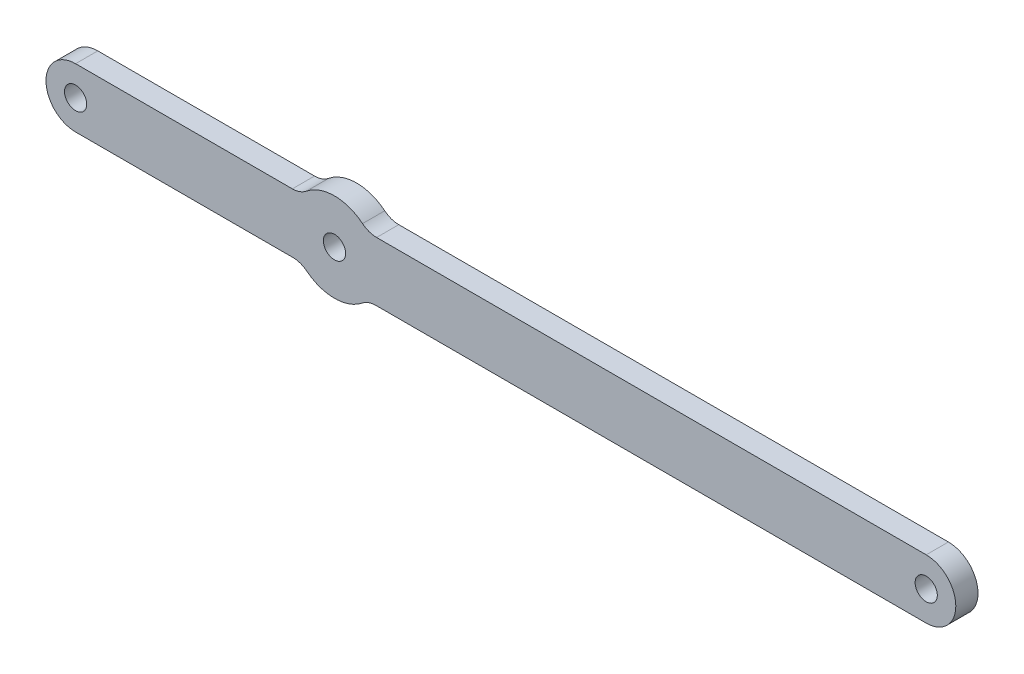
ISO-10303-21;
HEADER;
FILE_DESCRIPTION(('STEP AP214'),'2;1');
FILE_NAME('part.step','',(''),(''),'','','');
FILE_SCHEMA(('AUTOMOTIVE_DESIGN { 1 0 10303 214 1 1 1 1 }'));
ENDSEC;
DATA;
#1=APPLICATION_CONTEXT('core data for automotive mechanical design processes');
#2=APPLICATION_PROTOCOL_DEFINITION('international standard','automotive_design',2000,#1);
#3=PRODUCT_CONTEXT('',#1,'mechanical');
#4=PRODUCT('Part','Part','',(#3));
#5=PRODUCT_RELATED_PRODUCT_CATEGORY('part','',(#4));
#6=PRODUCT_DEFINITION_FORMATION('','',#4);
#7=PRODUCT_DEFINITION_CONTEXT('part definition',#1,'design');
#8=PRODUCT_DEFINITION('design','',#6,#7);
#9=PRODUCT_DEFINITION_SHAPE('','',#8);
#10=(LENGTH_UNIT() NAMED_UNIT(*) SI_UNIT(.MILLI.,.METRE.));
#11=(NAMED_UNIT(*) PLANE_ANGLE_UNIT() SI_UNIT($,.RADIAN.));
#12=(NAMED_UNIT(*) SI_UNIT($,.STERADIAN.) SOLID_ANGLE_UNIT());
#13=UNCERTAINTY_MEASURE_WITH_UNIT(LENGTH_MEASURE(1.E-05),#10,'distance_accuracy_value','');
#14=(GEOMETRIC_REPRESENTATION_CONTEXT(3) GLOBAL_UNCERTAINTY_ASSIGNED_CONTEXT((#13)) GLOBAL_UNIT_ASSIGNED_CONTEXT((#10,
#11,#12)) REPRESENTATION_CONTEXT('',''));
#15=CARTESIAN_POINT('',(0.,0.,0.));
#16=DIRECTION('',(0.,0.,1.));
#17=DIRECTION('',(1.,0.,0.));
#18=AXIS2_PLACEMENT_3D('',#15,#16,#17);
#19=CARTESIAN_POINT('',(101.910180697189,73.7175253104358,3.));
#20=DIRECTION('',(0.,0.,1.));
#21=DIRECTION('',(1.,0.,0.));
#22=AXIS2_PLACEMENT_3D('',#19,#20,#21);
#23=PLANE('',#22);
#24=CARTESIAN_POINT('',(216.910180697189,73.7175253104358,3.));
#25=DIRECTION('',(0.,0.,1.));
#26=DIRECTION('',(1.,0.,0.));
#27=AXIS2_PLACEMENT_3D('',#24,#25,#26);
#28=CIRCLE('',#27,1.5);
#29=CARTESIAN_POINT('',(218.410180697189,73.7175253104358,3.));
#30=VERTEX_POINT('',#29);
#31=EDGE_CURVE('E291',#30,#30,#28,.T.);
#32=ORIENTED_EDGE('',*,*,#31,.F.);
#33=EDGE_LOOP('',(#32));
#34=FACE_BOUND('',#33,.T.);
#35=CARTESIAN_POINT('',(101.910180697189,73.7175253104358,3.));
#36=DIRECTION('',(0.,0.,1.));
#37=DIRECTION('',(1.,0.,0.));
#38=AXIS2_PLACEMENT_3D('',#35,#36,#37);
#39=CIRCLE('',#38,4.);
#40=CARTESIAN_POINT('',(101.910180697189,77.7175253104358,3.));
#41=VERTEX_POINT('',#40);
#42=CARTESIAN_POINT('',(101.910180697189,69.7175253104358,3.));
#43=VERTEX_POINT('',#42);
#44=EDGE_CURVE('E181',#41,#43,#39,.T.);
#45=ORIENTED_EDGE('',*,*,#44,.T.);
#46=DIRECTION('',(1.,0.,0.));
#47=VECTOR('',#46,1.);
#48=CARTESIAN_POINT('',(101.910180697189,69.7175253104358,3.));
#49=LINE('',#48,#47);
#50=CARTESIAN_POINT('',(131.290219007058,69.7175253104358,3.));
#51=VERTEX_POINT('',#50);
#52=EDGE_CURVE('E109',#43,#51,#49,.T.);
#53=ORIENTED_EDGE('',*,*,#52,.T.);
#54=CARTESIAN_POINT('',(131.290219007058,66.7175253104358,3.));
#55=DIRECTION('',(0.,0.,-1.));
#56=DIRECTION('',(-1.,0.,0.));
#57=AXIS2_PLACEMENT_3D('',#54,#55,#56);
#58=CIRCLE('',#57,2.99999999999999);
#59=CARTESIAN_POINT('',(133.163539570435,69.060743197622,3.));
#60=VERTEX_POINT('',#59);
#61=EDGE_CURVE('E208',#51,#60,#58,.T.);
#62=ORIENTED_EDGE('',*,*,#61,.T.);
#63=CARTESIAN_POINT('',(136.910180697189,73.7471789719943,3.));
#64=DIRECTION('',(0.,0.,1.));
#65=DIRECTION('',(1.,0.,0.));
#66=AXIS2_PLACEMENT_3D('',#63,#64,#65);
#67=CIRCLE('',#66,6.00000000000002);
#68=CARTESIAN_POINT('',(140.656821823943,69.060743197622,3.));
#69=VERTEX_POINT('',#68);
#70=EDGE_CURVE('E227',#60,#69,#67,.T.);
#71=ORIENTED_EDGE('',*,*,#70,.T.);
#72=CARTESIAN_POINT('',(142.530142387319,66.7175253104358,3.));
#73=DIRECTION('',(0.,0.,-1.));
#74=DIRECTION('',(-1.,0.,0.));
#75=AXIS2_PLACEMENT_3D('',#72,#73,#74);
#76=CIRCLE('',#75,2.99999999999999);
#77=CARTESIAN_POINT('',(142.530142387319,69.7175253104358,3.));
#78=VERTEX_POINT('',#77);
#79=EDGE_CURVE('E224',#69,#78,#76,.T.);
#80=ORIENTED_EDGE('',*,*,#79,.T.);
#81=DIRECTION('',(1.,0.,0.));
#82=VECTOR('',#81,1.);
#83=CARTESIAN_POINT('',(142.530142387319,69.7175253104358,3.));
#84=LINE('',#83,#82);
#85=CARTESIAN_POINT('',(216.910180697189,69.7175253104358,3.));
#86=VERTEX_POINT('',#85);
#87=EDGE_CURVE('E226',#78,#86,#84,.T.);
#88=ORIENTED_EDGE('',*,*,#87,.T.);
#89=CARTESIAN_POINT('',(216.910180697189,73.7175253104358,3.));
#90=DIRECTION('',(0.,0.,1.));
#91=DIRECTION('',(1.,0.,0.));
#92=AXIS2_PLACEMENT_3D('',#89,#90,#91);
#93=CIRCLE('',#92,4.);
#94=CARTESIAN_POINT('',(216.910180697189,77.7175253104358,3.));
#95=VERTEX_POINT('',#94);
#96=EDGE_CURVE('E229',#86,#95,#93,.T.);
#97=ORIENTED_EDGE('',*,*,#96,.T.);
#98=DIRECTION('',(-1.,0.,0.));
#99=VECTOR('',#98,1.);
#100=CARTESIAN_POINT('',(142.60353400804,77.7175253104358,3.));
#101=LINE('',#100,#99);
#102=CARTESIAN_POINT('',(142.60353400804,77.7175253104358,3.));
#103=VERTEX_POINT('',#102);
#104=EDGE_CURVE('E235',#95,#103,#101,.T.);
#105=ORIENTED_EDGE('',*,*,#104,.T.);
#106=CARTESIAN_POINT('',(142.60353400804,80.7175253104358,3.));
#107=DIRECTION('',(0.,0.,-1.));
#108=DIRECTION('',(-1.,0.,0.));
#109=AXIS2_PLACEMENT_3D('',#106,#107,#108);
#110=CIRCLE('',#109,3.);
#111=CARTESIAN_POINT('',(140.705749571089,78.3940765309553,3.));
#112=VERTEX_POINT('',#111);
#113=EDGE_CURVE('E140',#103,#112,#110,.T.);
#114=ORIENTED_EDGE('',*,*,#113,.T.);
#115=CARTESIAN_POINT('',(136.910180697189,73.7471789719943,3.));
#116=DIRECTION('',(0.,0.,1.));
#117=DIRECTION('',(1.,0.,0.));
#118=AXIS2_PLACEMENT_3D('',#115,#116,#117);
#119=CIRCLE('',#118,6.);
#120=CARTESIAN_POINT('',(133.114611823288,78.3940765309553,3.));
#121=VERTEX_POINT('',#120);
#122=EDGE_CURVE('E134',#112,#121,#119,.T.);
#123=ORIENTED_EDGE('',*,*,#122,.T.);
#124=CARTESIAN_POINT('',(131.216827386338,80.7175253104358,3.));
#125=DIRECTION('',(0.,0.,-1.));
#126=DIRECTION('',(-1.,0.,0.));
#127=AXIS2_PLACEMENT_3D('',#124,#125,#126);
#128=CIRCLE('',#127,3.);
#129=CARTESIAN_POINT('',(131.216827386338,77.7175253104358,3.));
#130=VERTEX_POINT('',#129);
#131=EDGE_CURVE('E138',#121,#130,#128,.T.);
#132=ORIENTED_EDGE('',*,*,#131,.T.);
#133=DIRECTION('',(-1.,0.,0.));
#134=VECTOR('',#133,1.);
#135=CARTESIAN_POINT('',(101.910180697189,77.7175253104358,3.));
#136=LINE('',#135,#134);
#137=EDGE_CURVE('E54',#130,#41,#136,.T.);
#138=ORIENTED_EDGE('',*,*,#137,.T.);
#139=EDGE_LOOP('',(#45,#53,#62,#71,#80,#88,#97,#105,#114,#123,#132,#138));
#140=FACE_BOUND('',#139,.T.);
#141=CARTESIAN_POINT('',(101.910180697189,73.7175253104358,3.));
#142=DIRECTION('',(0.,0.,1.));
#143=DIRECTION('',(1.,0.,0.));
#144=AXIS2_PLACEMENT_3D('',#141,#142,#143);
#145=CIRCLE('',#144,1.5);
#146=CARTESIAN_POINT('',(103.410180697189,73.7175253104358,3.));
#147=VERTEX_POINT('',#146);
#148=EDGE_CURVE('E162',#147,#147,#145,.T.);
#149=ORIENTED_EDGE('',*,*,#148,.F.);
#150=EDGE_LOOP('',(#149));
#151=FACE_BOUND('',#150,.T.);
#152=CARTESIAN_POINT('',(136.910180697189,73.7471789719943,3.));
#153=DIRECTION('',(0.,0.,1.));
#154=DIRECTION('',(1.,0.,0.));
#155=AXIS2_PLACEMENT_3D('',#152,#153,#154);
#156=CIRCLE('',#155,1.5);
#157=CARTESIAN_POINT('',(138.410180697189,73.7471789719943,3.));
#158=VERTEX_POINT('',#157);
#159=EDGE_CURVE('E282',#158,#158,#156,.T.);
#160=ORIENTED_EDGE('',*,*,#159,.F.);
#161=EDGE_LOOP('',(#160));
#162=FACE_BOUND('',#161,.T.);
#163=ADVANCED_FACE('F37',(#34,#140,#151,#162),#23,.T.);
#164=CARTESIAN_POINT('',(101.910180697189,73.7175253104358,0.));
#165=DIRECTION('',(0.,0.,1.));
#166=DIRECTION('',(1.,0.,0.));
#167=AXIS2_PLACEMENT_3D('',#164,#165,#166);
#168=PLANE('',#167);
#169=CARTESIAN_POINT('',(216.910180697189,73.7175253104358,0.));
#170=DIRECTION('',(0.,0.,1.));
#171=DIRECTION('',(1.,0.,0.));
#172=AXIS2_PLACEMENT_3D('',#169,#170,#171);
#173=CIRCLE('',#172,1.5);
#174=CARTESIAN_POINT('',(218.410180697189,73.7175253104358,0.));
#175=VERTEX_POINT('',#174);
#176=EDGE_CURVE('E288',#175,#175,#173,.T.);
#177=ORIENTED_EDGE('',*,*,#176,.T.);
#178=EDGE_LOOP('',(#177));
#179=FACE_BOUND('',#178,.T.);
#180=CARTESIAN_POINT('',(101.910180697189,73.7175253104358,0.));
#181=DIRECTION('',(0.,0.,1.));
#182=DIRECTION('',(1.,0.,0.));
#183=AXIS2_PLACEMENT_3D('',#180,#181,#182);
#184=CIRCLE('',#183,4.);
#185=CARTESIAN_POINT('',(101.910180697189,77.7175253104358,0.));
#186=VERTEX_POINT('',#185);
#187=CARTESIAN_POINT('',(101.910180697189,69.7175253104358,0.));
#188=VERTEX_POINT('',#187);
#189=EDGE_CURVE('E158',#186,#188,#184,.T.);
#190=ORIENTED_EDGE('',*,*,#189,.F.);
#191=DIRECTION('',(-1.,0.,0.));
#192=VECTOR('',#191,1.);
#193=CARTESIAN_POINT('',(101.910180697189,77.7175253104358,0.));
#194=LINE('',#193,#192);
#195=CARTESIAN_POINT('',(131.216827386338,77.7175253104358,0.));
#196=VERTEX_POINT('',#195);
#197=EDGE_CURVE('E101',#196,#186,#194,.T.);
#198=ORIENTED_EDGE('',*,*,#197,.F.);
#199=CARTESIAN_POINT('',(131.216827386338,80.7175253104358,0.));
#200=DIRECTION('',(0.,0.,-1.));
#201=DIRECTION('',(-1.,0.,0.));
#202=AXIS2_PLACEMENT_3D('',#199,#200,#201);
#203=CIRCLE('',#202,3.);
#204=CARTESIAN_POINT('',(133.114611823288,78.3940765309553,0.));
#205=VERTEX_POINT('',#204);
#206=EDGE_CURVE('E95',#205,#196,#203,.T.);
#207=ORIENTED_EDGE('',*,*,#206,.F.);
#208=CARTESIAN_POINT('',(136.910180697189,73.7471789719943,0.));
#209=DIRECTION('',(0.,0.,1.));
#210=DIRECTION('',(1.,0.,0.));
#211=AXIS2_PLACEMENT_3D('',#208,#209,#210);
#212=CIRCLE('',#211,6.);
#213=CARTESIAN_POINT('',(140.705749571089,78.3940765309553,0.));
#214=VERTEX_POINT('',#213);
#215=EDGE_CURVE('E148',#214,#205,#212,.T.);
#216=ORIENTED_EDGE('',*,*,#215,.F.);
#217=CARTESIAN_POINT('',(142.60353400804,80.7175253104358,0.));
#218=DIRECTION('',(0.,0.,-1.));
#219=DIRECTION('',(-1.,0.,0.));
#220=AXIS2_PLACEMENT_3D('',#217,#218,#219);
#221=CIRCLE('',#220,3.);
#222=CARTESIAN_POINT('',(142.60353400804,77.7175253104358,0.));
#223=VERTEX_POINT('',#222);
#224=EDGE_CURVE('E176',#223,#214,#221,.T.);
#225=ORIENTED_EDGE('',*,*,#224,.F.);
#226=DIRECTION('',(-1.,0.,0.));
#227=VECTOR('',#226,1.);
#228=CARTESIAN_POINT('',(142.60353400804,77.7175253104358,0.));
#229=LINE('',#228,#227);
#230=CARTESIAN_POINT('',(216.910180697189,77.7175253104358,0.));
#231=VERTEX_POINT('',#230);
#232=EDGE_CURVE('E174',#231,#223,#229,.T.);
#233=ORIENTED_EDGE('',*,*,#232,.F.);
#234=CARTESIAN_POINT('',(216.910180697189,73.7175253104358,0.));
#235=DIRECTION('',(0.,0.,1.));
#236=DIRECTION('',(1.,0.,0.));
#237=AXIS2_PLACEMENT_3D('',#234,#235,#236);
#238=CIRCLE('',#237,4.);
#239=CARTESIAN_POINT('',(216.910180697189,69.7175253104358,0.));
#240=VERTEX_POINT('',#239);
#241=EDGE_CURVE('E172',#240,#231,#238,.T.);
#242=ORIENTED_EDGE('',*,*,#241,.F.);
#243=DIRECTION('',(1.,0.,0.));
#244=VECTOR('',#243,1.);
#245=CARTESIAN_POINT('',(142.530142387319,69.7175253104358,0.));
#246=LINE('',#245,#244);
#247=CARTESIAN_POINT('',(142.530142387319,69.7175253104358,0.));
#248=VERTEX_POINT('',#247);
#249=EDGE_CURVE('E170',#248,#240,#246,.T.);
#250=ORIENTED_EDGE('',*,*,#249,.F.);
#251=CARTESIAN_POINT('',(142.530142387319,66.7175253104358,0.));
#252=DIRECTION('',(0.,0.,-1.));
#253=DIRECTION('',(-1.,0.,0.));
#254=AXIS2_PLACEMENT_3D('',#251,#252,#253);
#255=CIRCLE('',#254,2.99999999999999);
#256=CARTESIAN_POINT('',(140.656821823943,69.060743197622,0.));
#257=VERTEX_POINT('',#256);
#258=EDGE_CURVE('E168',#257,#248,#255,.T.);
#259=ORIENTED_EDGE('',*,*,#258,.F.);
#260=CARTESIAN_POINT('',(136.910180697189,73.7471789719943,0.));
#261=DIRECTION('',(0.,0.,1.));
#262=DIRECTION('',(1.,0.,0.));
#263=AXIS2_PLACEMENT_3D('',#260,#261,#262);
#264=CIRCLE('',#263,6.00000000000002);
#265=CARTESIAN_POINT('',(133.163539570435,69.060743197622,0.));
#266=VERTEX_POINT('',#265);
#267=EDGE_CURVE('E166',#266,#257,#264,.T.);
#268=ORIENTED_EDGE('',*,*,#267,.F.);
#269=CARTESIAN_POINT('',(131.290219007058,66.7175253104358,0.));
#270=DIRECTION('',(0.,0.,-1.));
#271=DIRECTION('',(-1.,0.,0.));
#272=AXIS2_PLACEMENT_3D('',#269,#270,#271);
#273=CIRCLE('',#272,2.99999999999999);
#274=CARTESIAN_POINT('',(131.290219007058,69.7175253104358,0.));
#275=VERTEX_POINT('',#274);
#276=EDGE_CURVE('E164',#275,#266,#273,.T.);
#277=ORIENTED_EDGE('',*,*,#276,.F.);
#278=DIRECTION('',(1.,0.,0.));
#279=VECTOR('',#278,1.);
#280=CARTESIAN_POINT('',(101.910180697189,69.7175253104358,0.));
#281=LINE('',#280,#279);
#282=EDGE_CURVE('E161',#188,#275,#281,.T.);
#283=ORIENTED_EDGE('',*,*,#282,.F.);
#284=EDGE_LOOP('',(#190,#198,#207,#216,#225,#233,#242,#250,#259,#268,#277,#283));
#285=FACE_BOUND('',#284,.T.);
#286=CARTESIAN_POINT('',(101.910180697189,73.7175253104358,0.));
#287=DIRECTION('',(0.,0.,1.));
#288=DIRECTION('',(1.,0.,0.));
#289=AXIS2_PLACEMENT_3D('',#286,#287,#288);
#290=CIRCLE('',#289,1.5);
#291=CARTESIAN_POINT('',(103.410180697189,73.7175253104358,0.));
#292=VERTEX_POINT('',#291);
#293=EDGE_CURVE('E294',#292,#292,#290,.T.);
#294=ORIENTED_EDGE('',*,*,#293,.T.);
#295=EDGE_LOOP('',(#294));
#296=FACE_BOUND('',#295,.T.);
#297=CARTESIAN_POINT('',(136.910180697189,73.7471789719943,0.));
#298=DIRECTION('',(0.,0.,1.));
#299=DIRECTION('',(1.,0.,0.));
#300=AXIS2_PLACEMENT_3D('',#297,#298,#299);
#301=CIRCLE('',#300,1.5);
#302=CARTESIAN_POINT('',(138.410180697189,73.7471789719943,0.));
#303=VERTEX_POINT('',#302);
#304=EDGE_CURVE('E285',#303,#303,#301,.T.);
#305=ORIENTED_EDGE('',*,*,#304,.T.);
#306=EDGE_LOOP('',(#305));
#307=FACE_BOUND('',#306,.T.);
#308=ADVANCED_FACE('F212',(#179,#285,#296,#307),#168,.F.);
#309=CARTESIAN_POINT('',(101.910180697189,73.7175253104358,3.));
#310=DIRECTION('',(0.,0.,-1.));
#311=DIRECTION('',(-1.,0.,0.));
#312=AXIS2_PLACEMENT_3D('',#309,#310,#311);
#313=CYLINDRICAL_SURFACE('',#312,4.);
#314=ORIENTED_EDGE('',*,*,#189,.T.);
#315=DIRECTION('',(0.,0.,-1.));
#316=VECTOR('',#315,1.);
#317=CARTESIAN_POINT('',(101.910180697189,69.7175253104358,3.));
#318=LINE('',#317,#316);
#319=EDGE_CURVE('E11',#43,#188,#318,.T.);
#320=ORIENTED_EDGE('',*,*,#319,.F.);
#321=ORIENTED_EDGE('',*,*,#44,.F.);
#322=DIRECTION('',(0.,0.,-1.));
#323=VECTOR('',#322,1.);
#324=CARTESIAN_POINT('',(101.910180697189,77.7175253104358,3.));
#325=LINE('',#324,#323);
#326=EDGE_CURVE('E154',#41,#186,#325,.T.);
#327=ORIENTED_EDGE('',*,*,#326,.T.);
#328=EDGE_LOOP('',(#314,#320,#321,#327));
#329=FACE_BOUND('',#328,.T.);
#330=ADVANCED_FACE('F39',(#329),#313,.T.);
#331=CARTESIAN_POINT('',(101.910180697189,69.7175253104358,3.));
#332=DIRECTION('',(0.,1.,0.));
#333=DIRECTION('',(0.,0.,1.));
#334=AXIS2_PLACEMENT_3D('',#331,#332,#333);
#335=PLANE('',#334);
#336=ORIENTED_EDGE('',*,*,#282,.T.);
#337=DIRECTION('',(0.,0.,-1.));
#338=VECTOR('',#337,1.);
#339=CARTESIAN_POINT('',(131.290219007058,69.7175253104358,3.));
#340=LINE('',#339,#338);
#341=EDGE_CURVE('E46',#51,#275,#340,.T.);
#342=ORIENTED_EDGE('',*,*,#341,.F.);
#343=ORIENTED_EDGE('',*,*,#52,.F.);
#344=ORIENTED_EDGE('',*,*,#319,.T.);
#345=EDGE_LOOP('',(#336,#342,#343,#344));
#346=FACE_BOUND('',#345,.T.);
#347=ADVANCED_FACE('F395',(#346),#335,.F.);
#348=CARTESIAN_POINT('',(131.290219007058,66.7175253104358,3.));
#349=DIRECTION('',(0.,0.,-1.));
#350=DIRECTION('',(-1.,0.,0.));
#351=AXIS2_PLACEMENT_3D('',#348,#349,#350);
#352=CYLINDRICAL_SURFACE('',#351,2.99999999999999);
#353=ORIENTED_EDGE('',*,*,#276,.T.);
#354=DIRECTION('',(0.,0.,-1.));
#355=VECTOR('',#354,1.);
#356=CARTESIAN_POINT('',(133.163539570435,69.060743197622,3.));
#357=LINE('',#356,#355);
#358=EDGE_CURVE('E200',#60,#266,#357,.T.);
#359=ORIENTED_EDGE('',*,*,#358,.F.);
#360=ORIENTED_EDGE('',*,*,#61,.F.);
#361=ORIENTED_EDGE('',*,*,#341,.T.);
#362=EDGE_LOOP('',(#353,#359,#360,#361));
#363=FACE_BOUND('',#362,.T.);
#364=ADVANCED_FACE('F206',(#363),#352,.F.);
#365=CARTESIAN_POINT('',(136.910180697189,73.7471789719943,3.));
#366=DIRECTION('',(0.,0.,-1.));
#367=DIRECTION('',(-1.,0.,0.));
#368=AXIS2_PLACEMENT_3D('',#365,#366,#367);
#369=CYLINDRICAL_SURFACE('',#368,6.00000000000002);
#370=ORIENTED_EDGE('',*,*,#267,.T.);
#371=DIRECTION('',(0.,0.,-1.));
#372=VECTOR('',#371,1.);
#373=CARTESIAN_POINT('',(140.656821823943,69.060743197622,3.));
#374=LINE('',#373,#372);
#375=EDGE_CURVE('E197',#69,#257,#374,.T.);
#376=ORIENTED_EDGE('',*,*,#375,.F.);
#377=ORIENTED_EDGE('',*,*,#70,.F.);
#378=ORIENTED_EDGE('',*,*,#358,.T.);
#379=EDGE_LOOP('',(#370,#376,#377,#378));
#380=FACE_BOUND('',#379,.T.);
#381=ADVANCED_FACE('F218',(#380),#369,.T.);
#382=CARTESIAN_POINT('',(142.530142387319,66.7175253104358,3.));
#383=DIRECTION('',(0.,0.,-1.));
#384=DIRECTION('',(-1.,0.,0.));
#385=AXIS2_PLACEMENT_3D('',#382,#383,#384);
#386=CYLINDRICAL_SURFACE('',#385,2.99999999999999);
#387=ORIENTED_EDGE('',*,*,#258,.T.);
#388=DIRECTION('',(0.,0.,-1.));
#389=VECTOR('',#388,1.);
#390=CARTESIAN_POINT('',(142.530142387319,69.7175253104358,3.));
#391=LINE('',#390,#389);
#392=EDGE_CURVE('E194',#78,#248,#391,.T.);
#393=ORIENTED_EDGE('',*,*,#392,.F.);
#394=ORIENTED_EDGE('',*,*,#79,.F.);
#395=ORIENTED_EDGE('',*,*,#375,.T.);
#396=EDGE_LOOP('',(#387,#393,#394,#395));
#397=FACE_BOUND('',#396,.T.);
#398=ADVANCED_FACE('F222',(#397),#386,.F.);
#399=CARTESIAN_POINT('',(142.530142387319,69.7175253104358,3.));
#400=DIRECTION('',(0.,1.,0.));
#401=DIRECTION('',(0.,0.,1.));
#402=AXIS2_PLACEMENT_3D('',#399,#400,#401);
#403=PLANE('',#402);
#404=ORIENTED_EDGE('',*,*,#249,.T.);
#405=DIRECTION('',(0.,0.,-1.));
#406=VECTOR('',#405,1.);
#407=CARTESIAN_POINT('',(216.910180697189,69.7175253104358,3.));
#408=LINE('',#407,#406);
#409=EDGE_CURVE('E191',#86,#240,#408,.T.);
#410=ORIENTED_EDGE('',*,*,#409,.F.);
#411=ORIENTED_EDGE('',*,*,#87,.F.);
#412=ORIENTED_EDGE('',*,*,#392,.T.);
#413=EDGE_LOOP('',(#404,#410,#411,#412));
#414=FACE_BOUND('',#413,.T.);
#415=ADVANCED_FACE('F360',(#414),#403,.F.);
#416=CARTESIAN_POINT('',(216.910180697189,73.7175253104358,3.));
#417=DIRECTION('',(0.,0.,-1.));
#418=DIRECTION('',(-1.,0.,0.));
#419=AXIS2_PLACEMENT_3D('',#416,#417,#418);
#420=CYLINDRICAL_SURFACE('',#419,4.);
#421=ORIENTED_EDGE('',*,*,#241,.T.);
#422=DIRECTION('',(0.,0.,-1.));
#423=VECTOR('',#422,1.);
#424=CARTESIAN_POINT('',(216.910180697189,77.7175253104358,3.));
#425=LINE('',#424,#423);
#426=EDGE_CURVE('E188',#95,#231,#425,.T.);
#427=ORIENTED_EDGE('',*,*,#426,.F.);
#428=ORIENTED_EDGE('',*,*,#96,.F.);
#429=ORIENTED_EDGE('',*,*,#409,.T.);
#430=EDGE_LOOP('',(#421,#427,#428,#429));
#431=FACE_BOUND('',#430,.T.);
#432=ADVANCED_FACE('F351',(#431),#420,.T.);
#433=CARTESIAN_POINT('',(142.60353400804,77.7175253104358,3.));
#434=DIRECTION('',(0.,-1.,0.));
#435=DIRECTION('',(0.,0.,-1.));
#436=AXIS2_PLACEMENT_3D('',#433,#434,#435);
#437=PLANE('',#436);
#438=ORIENTED_EDGE('',*,*,#232,.T.);
#439=DIRECTION('',(0.,0.,-1.));
#440=VECTOR('',#439,1.);
#441=CARTESIAN_POINT('',(142.60353400804,77.7175253104358,3.));
#442=LINE('',#441,#440);
#443=EDGE_CURVE('E185',#103,#223,#442,.T.);
#444=ORIENTED_EDGE('',*,*,#443,.F.);
#445=ORIENTED_EDGE('',*,*,#104,.F.);
#446=ORIENTED_EDGE('',*,*,#426,.T.);
#447=EDGE_LOOP('',(#438,#444,#445,#446));
#448=FACE_BOUND('',#447,.T.);
#449=ADVANCED_FACE('F241',(#448),#437,.F.);
#450=CARTESIAN_POINT('',(142.60353400804,80.7175253104358,3.));
#451=DIRECTION('',(0.,0.,-1.));
#452=DIRECTION('',(-1.,0.,0.));
#453=AXIS2_PLACEMENT_3D('',#450,#451,#452);
#454=CYLINDRICAL_SURFACE('',#453,3.);
#455=ORIENTED_EDGE('',*,*,#224,.T.);
#456=DIRECTION('',(0.,0.,-1.));
#457=VECTOR('',#456,1.);
#458=CARTESIAN_POINT('',(140.705749571089,78.3940765309553,3.));
#459=LINE('',#458,#457);
#460=EDGE_CURVE('E149',#112,#214,#459,.T.);
#461=ORIENTED_EDGE('',*,*,#460,.F.);
#462=ORIENTED_EDGE('',*,*,#113,.F.);
#463=ORIENTED_EDGE('',*,*,#443,.T.);
#464=EDGE_LOOP('',(#455,#461,#462,#463));
#465=FACE_BOUND('',#464,.T.);
#466=ADVANCED_FACE('F245',(#465),#454,.F.);
#467=CARTESIAN_POINT('',(136.910180697189,73.7471789719943,3.));
#468=DIRECTION('',(0.,0.,-1.));
#469=DIRECTION('',(-1.,0.,0.));
#470=AXIS2_PLACEMENT_3D('',#467,#468,#469);
#471=CYLINDRICAL_SURFACE('',#470,6.);
#472=ORIENTED_EDGE('',*,*,#215,.T.);
#473=DIRECTION('',(0.,0.,-1.));
#474=VECTOR('',#473,1.);
#475=CARTESIAN_POINT('',(133.114611823288,78.3940765309553,3.));
#476=LINE('',#475,#474);
#477=EDGE_CURVE('E145',#121,#205,#476,.T.);
#478=ORIENTED_EDGE('',*,*,#477,.F.);
#479=ORIENTED_EDGE('',*,*,#122,.F.);
#480=ORIENTED_EDGE('',*,*,#460,.T.);
#481=EDGE_LOOP('',(#472,#478,#479,#480));
#482=FACE_BOUND('',#481,.T.);
#483=ADVANCED_FACE('F146',(#482),#471,.T.);
#484=CARTESIAN_POINT('',(131.216827386338,80.7175253104358,3.));
#485=DIRECTION('',(0.,0.,-1.));
#486=DIRECTION('',(-1.,0.,0.));
#487=AXIS2_PLACEMENT_3D('',#484,#485,#486);
#488=CYLINDRICAL_SURFACE('',#487,3.);
#489=ORIENTED_EDGE('',*,*,#206,.T.);
#490=DIRECTION('',(0.,0.,-1.));
#491=VECTOR('',#490,1.);
#492=CARTESIAN_POINT('',(131.216827386338,77.7175253104358,3.));
#493=LINE('',#492,#491);
#494=EDGE_CURVE('E150',#130,#196,#493,.T.);
#495=ORIENTED_EDGE('',*,*,#494,.F.);
#496=ORIENTED_EDGE('',*,*,#131,.F.);
#497=ORIENTED_EDGE('',*,*,#477,.T.);
#498=EDGE_LOOP('',(#489,#495,#496,#497));
#499=FACE_BOUND('',#498,.T.);
#500=ADVANCED_FACE('F152',(#499),#488,.F.);
#501=CARTESIAN_POINT('',(101.910180697189,77.7175253104358,3.));
#502=DIRECTION('',(0.,-1.,0.));
#503=DIRECTION('',(0.,0.,-1.));
#504=AXIS2_PLACEMENT_3D('',#501,#502,#503);
#505=PLANE('',#504);
#506=ORIENTED_EDGE('',*,*,#197,.T.);
#507=ORIENTED_EDGE('',*,*,#326,.F.);
#508=ORIENTED_EDGE('',*,*,#137,.F.);
#509=ORIENTED_EDGE('',*,*,#494,.T.);
#510=EDGE_LOOP('',(#506,#507,#508,#509));
#511=FACE_BOUND('',#510,.T.);
#512=ADVANCED_FACE('F249',(#511),#505,.F.);
#513=CARTESIAN_POINT('',(101.910180697189,73.7175253104358,3.));
#514=DIRECTION('',(0.,0.,-1.));
#515=DIRECTION('',(-1.,0.,0.));
#516=AXIS2_PLACEMENT_3D('',#513,#514,#515);
#517=CYLINDRICAL_SURFACE('',#516,1.5);
#518=ORIENTED_EDGE('',*,*,#148,.T.);
#519=EDGE_LOOP('',(#518));
#520=FACE_BOUND('',#519,.T.);
#521=ORIENTED_EDGE('',*,*,#293,.F.);
#522=EDGE_LOOP('',(#521));
#523=FACE_BOUND('',#522,.T.);
#524=ADVANCED_FACE('F251',(#520,#523),#517,.F.);
#525=CARTESIAN_POINT('',(216.910180697189,73.7175253104358,3.));
#526=DIRECTION('',(0.,0.,-1.));
#527=DIRECTION('',(-1.,0.,0.));
#528=AXIS2_PLACEMENT_3D('',#525,#526,#527);
#529=CYLINDRICAL_SURFACE('',#528,1.5);
#530=ORIENTED_EDGE('',*,*,#31,.T.);
#531=EDGE_LOOP('',(#530));
#532=FACE_BOUND('',#531,.T.);
#533=ORIENTED_EDGE('',*,*,#176,.F.);
#534=EDGE_LOOP('',(#533));
#535=FACE_BOUND('',#534,.T.);
#536=ADVANCED_FACE('F257',(#532,#535),#529,.F.);
#537=CARTESIAN_POINT('',(136.910180697189,73.7471789719943,3.));
#538=DIRECTION('',(0.,0.,-1.));
#539=DIRECTION('',(-1.,0.,0.));
#540=AXIS2_PLACEMENT_3D('',#537,#538,#539);
#541=CYLINDRICAL_SURFACE('',#540,1.5);
#542=ORIENTED_EDGE('',*,*,#159,.T.);
#543=EDGE_LOOP('',(#542));
#544=FACE_BOUND('',#543,.T.);
#545=ORIENTED_EDGE('',*,*,#304,.F.);
#546=EDGE_LOOP('',(#545));
#547=FACE_BOUND('',#546,.T.);
#548=ADVANCED_FACE('F273',(#544,#547),#541,.F.);
#549=CLOSED_SHELL('',(#163,#308,#330,#347,#364,#381,#398,#415,#432,#449,#466,#483,#500,#512,
#524,#536,#548));
#550=MANIFOLD_SOLID_BREP('B2',#549);
#551=ADVANCED_BREP_SHAPE_REPRESENTATION('',(#18,#550),#14);
#552=SHAPE_DEFINITION_REPRESENTATION(#9,#551);
ENDSEC;
END-ISO-10303-21;
